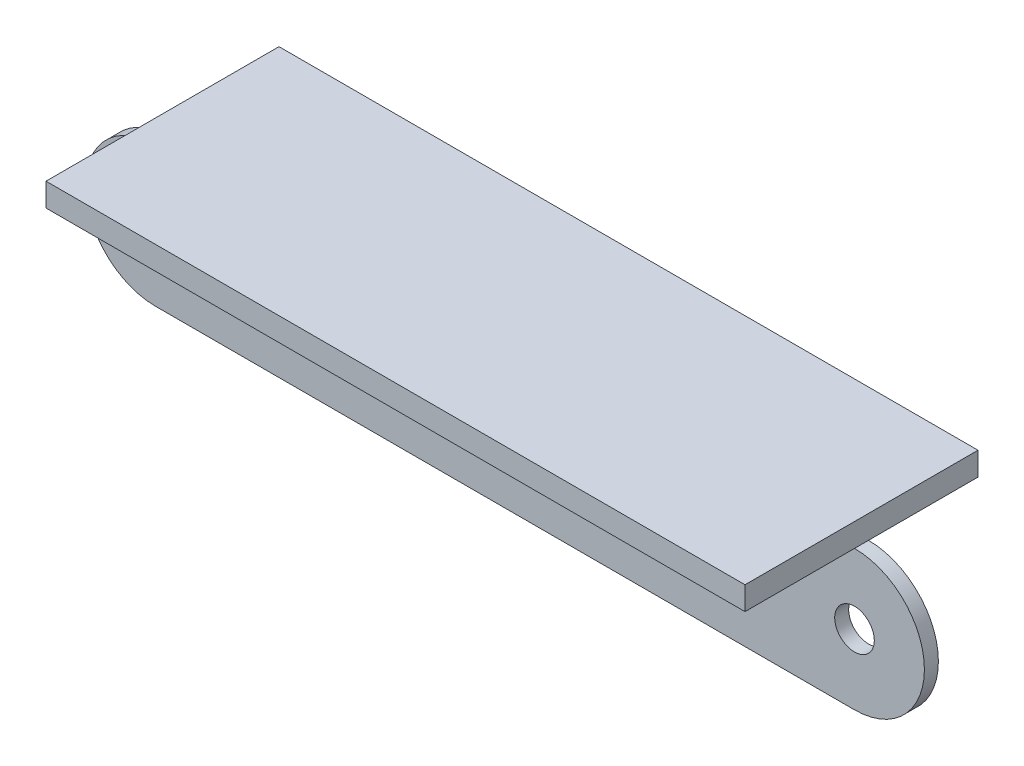
ISO-10303-21;
HEADER;
FILE_DESCRIPTION(('STEP AP214'),'2;1');
FILE_NAME('part.step','',(''),(''),'','','');
FILE_SCHEMA(('AUTOMOTIVE_DESIGN { 1 0 10303 214 1 1 1 1 }'));
ENDSEC;
DATA;
#1=APPLICATION_CONTEXT('core data for automotive mechanical design processes');
#2=APPLICATION_PROTOCOL_DEFINITION('international standard','automotive_design',2000,#1);
#3=PRODUCT_CONTEXT('',#1,'mechanical');
#4=PRODUCT('Part','Part','',(#3));
#5=PRODUCT_RELATED_PRODUCT_CATEGORY('part','',(#4));
#6=PRODUCT_DEFINITION_FORMATION('','',#4);
#7=PRODUCT_DEFINITION_CONTEXT('part definition',#1,'design');
#8=PRODUCT_DEFINITION('design','',#6,#7);
#9=PRODUCT_DEFINITION_SHAPE('','',#8);
#10=(LENGTH_UNIT() NAMED_UNIT(*) SI_UNIT(.MILLI.,.METRE.));
#11=(NAMED_UNIT(*) PLANE_ANGLE_UNIT() SI_UNIT($,.RADIAN.));
#12=(NAMED_UNIT(*) SI_UNIT($,.STERADIAN.) SOLID_ANGLE_UNIT());
#13=UNCERTAINTY_MEASURE_WITH_UNIT(LENGTH_MEASURE(1.E-05),#10,'distance_accuracy_value','');
#14=(GEOMETRIC_REPRESENTATION_CONTEXT(3) GLOBAL_UNCERTAINTY_ASSIGNED_CONTEXT((#13)) GLOBAL_UNIT_ASSIGNED_CONTEXT((#10,
#11,#12)) REPRESENTATION_CONTEXT('',''));
#15=CARTESIAN_POINT('',(0.,0.,0.));
#16=DIRECTION('',(0.,0.,1.));
#17=DIRECTION('',(1.,0.,0.));
#18=AXIS2_PLACEMENT_3D('',#15,#16,#17);
#19=CARTESIAN_POINT('',(-85.207100591716,11.1834319526627,3.));
#20=DIRECTION('',(0.,0.,-1.));
#21=DIRECTION('',(-1.,0.,0.));
#22=AXIS2_PLACEMENT_3D('',#19,#20,#21);
#23=PLANE('',#22);
#24=DIRECTION('',(-1.,0.,0.));
#25=VECTOR('',#24,1.);
#26=CARTESIAN_POINT('',(-85.207100591716,26.1834319526627,3.));
#27=LINE('',#26,#25);
#28=CARTESIAN_POINT('',(64.792899408284,26.1834319526627,3.));
#29=VERTEX_POINT('',#28);
#30=CARTESIAN_POINT('',(39.792899408284,26.1834319526627,3.));
#31=VERTEX_POINT('',#30);
#32=EDGE_CURVE('E277',#29,#31,#27,.T.);
#33=ORIENTED_EDGE('',*,*,#32,.T.);
#34=DIRECTION('',(0.,-1.,0.));
#35=VECTOR('',#34,1.);
#36=CARTESIAN_POINT('',(39.792899408284,26.1834319526627,3.));
#37=LINE('',#36,#35);
#38=CARTESIAN_POINT('',(39.792899408284,19.6834319526627,3.));
#39=VERTEX_POINT('',#38);
#40=EDGE_CURVE('E179',#31,#39,#37,.T.);
#41=ORIENTED_EDGE('',*,*,#40,.T.);
#42=DIRECTION('',(-1.,0.,0.));
#43=VECTOR('',#42,1.);
#44=CARTESIAN_POINT('',(39.792899408284,19.6834319526627,3.));
#45=LINE('',#44,#43);
#46=CARTESIAN_POINT('',(-60.207100591716,19.6834319526627,3.));
#47=VERTEX_POINT('',#46);
#48=EDGE_CURVE('E189',#39,#47,#45,.T.);
#49=ORIENTED_EDGE('',*,*,#48,.T.);
#50=DIRECTION('',(0.,-1.,0.));
#51=VECTOR('',#50,1.);
#52=CARTESIAN_POINT('',(-60.207100591716,26.1834319526627,3.));
#53=LINE('',#52,#51);
#54=CARTESIAN_POINT('',(-60.207100591716,26.1834319526627,3.));
#55=VERTEX_POINT('',#54);
#56=EDGE_CURVE('E164',#55,#47,#53,.T.);
#57=ORIENTED_EDGE('',*,*,#56,.F.);
#58=CARTESIAN_POINT('',(-85.207100591716,26.1834319526627,3.));
#59=VERTEX_POINT('',#58);
#60=EDGE_CURVE('E276',#55,#59,#27,.T.);
#61=ORIENTED_EDGE('',*,*,#60,.T.);
#62=CARTESIAN_POINT('',(-85.207100591716,11.1834319526627,3.));
#63=DIRECTION('',(0.,0.,1.));
#64=DIRECTION('',(-1.,0.,0.));
#65=AXIS2_PLACEMENT_3D('',#62,#63,#64);
#66=CIRCLE('',#65,15.);
#67=CARTESIAN_POINT('',(-85.207100591716,-3.81656804733729,3.));
#68=VERTEX_POINT('',#67);
#69=EDGE_CURVE('E265',#59,#68,#66,.T.);
#70=ORIENTED_EDGE('',*,*,#69,.T.);
#71=DIRECTION('',(1.,0.,0.));
#72=VECTOR('',#71,1.);
#73=CARTESIAN_POINT('',(-85.207100591716,-3.81656804733729,3.));
#74=LINE('',#73,#72);
#75=CARTESIAN_POINT('',(64.792899408284,-3.81656804733729,3.));
#76=VERTEX_POINT('',#75);
#77=EDGE_CURVE('E269',#68,#76,#74,.T.);
#78=ORIENTED_EDGE('',*,*,#77,.T.);
#79=CARTESIAN_POINT('',(64.792899408284,11.1834319526627,3.));
#80=DIRECTION('',(0.,0.,1.));
#81=DIRECTION('',(-1.,0.,0.));
#82=AXIS2_PLACEMENT_3D('',#79,#80,#81);
#83=CIRCLE('',#82,15.);
#84=EDGE_CURVE('E273',#76,#29,#83,.T.);
#85=ORIENTED_EDGE('',*,*,#84,.T.);
#86=EDGE_LOOP('',(#33,#41,#49,#57,#61,#70,#78,#85));
#87=FACE_BOUND('',#86,.T.);
#88=CARTESIAN_POINT('',(-85.207100591716,11.1834319526627,3.));
#89=DIRECTION('',(0.,0.,1.));
#90=DIRECTION('',(1.,0.,0.));
#91=AXIS2_PLACEMENT_3D('',#88,#89,#90);
#92=CIRCLE('',#91,4.25000000000001);
#93=CARTESIAN_POINT('',(-80.957100591716,11.1834319526627,3.));
#94=VERTEX_POINT('',#93);
#95=EDGE_CURVE('E257',#94,#94,#92,.T.);
#96=ORIENTED_EDGE('',*,*,#95,.F.);
#97=EDGE_LOOP('',(#96));
#98=FACE_BOUND('',#97,.T.);
#99=CARTESIAN_POINT('',(64.792899408284,11.1834319526627,3.));
#100=DIRECTION('',(0.,0.,1.));
#101=DIRECTION('',(1.,0.,0.));
#102=AXIS2_PLACEMENT_3D('',#99,#100,#101);
#103=CIRCLE('',#102,4.25000000000001);
#104=CARTESIAN_POINT('',(69.042899408284,11.1834319526627,3.));
#105=VERTEX_POINT('',#104);
#106=EDGE_CURVE('E249',#105,#105,#103,.T.);
#107=ORIENTED_EDGE('',*,*,#106,.F.);
#108=EDGE_LOOP('',(#107));
#109=FACE_BOUND('',#108,.T.);
#110=ADVANCED_FACE('F43',(#87,#98,#109),#23,.F.);
#111=CARTESIAN_POINT('',(-85.207100591716,11.1834319526627,0.));
#112=DIRECTION('',(0.,0.,-1.));
#113=DIRECTION('',(-1.,0.,0.));
#114=AXIS2_PLACEMENT_3D('',#111,#112,#113);
#115=PLANE('',#114);
#116=DIRECTION('',(0.,1.,0.));
#117=VECTOR('',#116,1.);
#118=CARTESIAN_POINT('',(39.792899408284,26.1834319526627,0.));
#119=LINE('',#118,#117);
#120=CARTESIAN_POINT('',(39.792899408284,19.6834319526627,0.));
#121=VERTEX_POINT('',#120);
#122=CARTESIAN_POINT('',(39.792899408284,26.1834319526627,0.));
#123=VERTEX_POINT('',#122);
#124=EDGE_CURVE('E154',#121,#123,#119,.T.);
#125=ORIENTED_EDGE('',*,*,#124,.T.);
#126=DIRECTION('',(-1.,0.,0.));
#127=VECTOR('',#126,1.);
#128=CARTESIAN_POINT('',(-85.207100591716,26.1834319526627,0.));
#129=LINE('',#128,#127);
#130=CARTESIAN_POINT('',(64.792899408284,26.1834319526627,0.));
#131=VERTEX_POINT('',#130);
#132=EDGE_CURVE('E270',#131,#123,#129,.T.);
#133=ORIENTED_EDGE('',*,*,#132,.F.);
#134=CARTESIAN_POINT('',(64.792899408284,11.1834319526627,0.));
#135=DIRECTION('',(0.,0.,1.));
#136=DIRECTION('',(-1.,0.,0.));
#137=AXIS2_PLACEMENT_3D('',#134,#135,#136);
#138=CIRCLE('',#137,15.);
#139=CARTESIAN_POINT('',(64.792899408284,-3.81656804733729,0.));
#140=VERTEX_POINT('',#139);
#141=EDGE_CURVE('E288',#140,#131,#138,.T.);
#142=ORIENTED_EDGE('',*,*,#141,.F.);
#143=DIRECTION('',(1.,0.,0.));
#144=VECTOR('',#143,1.);
#145=CARTESIAN_POINT('',(-85.207100591716,-3.81656804733729,0.));
#146=LINE('',#145,#144);
#147=CARTESIAN_POINT('',(-85.207100591716,-3.81656804733729,0.));
#148=VERTEX_POINT('',#147);
#149=EDGE_CURVE('E285',#148,#140,#146,.T.);
#150=ORIENTED_EDGE('',*,*,#149,.F.);
#151=CARTESIAN_POINT('',(-85.207100591716,11.1834319526627,0.));
#152=DIRECTION('',(0.,0.,1.));
#153=DIRECTION('',(-1.,0.,0.));
#154=AXIS2_PLACEMENT_3D('',#151,#152,#153);
#155=CIRCLE('',#154,15.);
#156=CARTESIAN_POINT('',(-85.207100591716,26.1834319526627,0.));
#157=VERTEX_POINT('',#156);
#158=EDGE_CURVE('E261',#157,#148,#155,.T.);
#159=ORIENTED_EDGE('',*,*,#158,.F.);
#160=CARTESIAN_POINT('',(-60.207100591716,26.1834319526627,0.));
#161=VERTEX_POINT('',#160);
#162=EDGE_CURVE('E292',#161,#157,#129,.T.);
#163=ORIENTED_EDGE('',*,*,#162,.F.);
#164=DIRECTION('',(0.,1.,0.));
#165=VECTOR('',#164,1.);
#166=CARTESIAN_POINT('',(-60.207100591716,26.1834319526627,0.));
#167=LINE('',#166,#165);
#168=CARTESIAN_POINT('',(-60.207100591716,19.6834319526627,0.));
#169=VERTEX_POINT('',#168);
#170=EDGE_CURVE('E64',#169,#161,#167,.T.);
#171=ORIENTED_EDGE('',*,*,#170,.F.);
#172=DIRECTION('',(-1.,0.,0.));
#173=VECTOR('',#172,1.);
#174=CARTESIAN_POINT('',(39.792899408284,19.6834319526627,0.));
#175=LINE('',#174,#173);
#176=EDGE_CURVE('E59',#121,#169,#175,.T.);
#177=ORIENTED_EDGE('',*,*,#176,.F.);
#178=EDGE_LOOP('',(#125,#133,#142,#150,#159,#163,#171,#177));
#179=FACE_BOUND('',#178,.T.);
#180=CARTESIAN_POINT('',(-85.207100591716,11.1834319526627,0.));
#181=DIRECTION('',(0.,0.,1.));
#182=DIRECTION('',(1.,0.,0.));
#183=AXIS2_PLACEMENT_3D('',#180,#181,#182);
#184=CIRCLE('',#183,4.25000000000001);
#185=CARTESIAN_POINT('',(-80.957100591716,11.1834319526627,0.));
#186=VERTEX_POINT('',#185);
#187=EDGE_CURVE('E253',#186,#186,#184,.T.);
#188=ORIENTED_EDGE('',*,*,#187,.T.);
#189=EDGE_LOOP('',(#188));
#190=FACE_BOUND('',#189,.T.);
#191=CARTESIAN_POINT('',(64.792899408284,11.1834319526627,0.));
#192=DIRECTION('',(0.,0.,1.));
#193=DIRECTION('',(1.,0.,0.));
#194=AXIS2_PLACEMENT_3D('',#191,#192,#193);
#195=CIRCLE('',#194,4.25000000000001);
#196=CARTESIAN_POINT('',(69.042899408284,11.1834319526627,0.));
#197=VERTEX_POINT('',#196);
#198=EDGE_CURVE('E248',#197,#197,#195,.T.);
#199=ORIENTED_EDGE('',*,*,#198,.T.);
#200=EDGE_LOOP('',(#199));
#201=FACE_BOUND('',#200,.T.);
#202=ADVANCED_FACE('F311',(#179,#190,#201),#115,.T.);
#203=CARTESIAN_POINT('',(-85.207100591716,11.1834319526627,3.));
#204=DIRECTION('',(0.,0.,-1.));
#205=DIRECTION('',(-1.,0.,0.));
#206=AXIS2_PLACEMENT_3D('',#203,#204,#205);
#207=CYLINDRICAL_SURFACE('',#206,15.);
#208=ORIENTED_EDGE('',*,*,#158,.T.);
#209=DIRECTION('',(0.,0.,-1.));
#210=VECTOR('',#209,1.);
#211=CARTESIAN_POINT('',(-85.207100591716,-3.81656804733729,3.));
#212=LINE('',#211,#210);
#213=EDGE_CURVE('E11',#68,#148,#212,.T.);
#214=ORIENTED_EDGE('',*,*,#213,.F.);
#215=ORIENTED_EDGE('',*,*,#69,.F.);
#216=DIRECTION('',(0.,0.,-1.));
#217=VECTOR('',#216,1.);
#218=CARTESIAN_POINT('',(-85.207100591716,26.1834319526627,3.));
#219=LINE('',#218,#217);
#220=EDGE_CURVE('E281',#59,#157,#219,.T.);
#221=ORIENTED_EDGE('',*,*,#220,.T.);
#222=EDGE_LOOP('',(#208,#214,#215,#221));
#223=FACE_BOUND('',#222,.T.);
#224=ADVANCED_FACE('F45',(#223),#207,.T.);
#225=CARTESIAN_POINT('',(-85.207100591716,-3.81656804733729,3.));
#226=DIRECTION('',(0.,1.,0.));
#227=DIRECTION('',(0.,0.,1.));
#228=AXIS2_PLACEMENT_3D('',#225,#226,#227);
#229=PLANE('',#228);
#230=ORIENTED_EDGE('',*,*,#149,.T.);
#231=DIRECTION('',(0.,0.,-1.));
#232=VECTOR('',#231,1.);
#233=CARTESIAN_POINT('',(64.792899408284,-3.81656804733729,3.));
#234=LINE('',#233,#232);
#235=EDGE_CURVE('E52',#76,#140,#234,.T.);
#236=ORIENTED_EDGE('',*,*,#235,.F.);
#237=ORIENTED_EDGE('',*,*,#77,.F.);
#238=ORIENTED_EDGE('',*,*,#213,.T.);
#239=EDGE_LOOP('',(#230,#236,#237,#238));
#240=FACE_BOUND('',#239,.T.);
#241=ADVANCED_FACE('F341',(#240),#229,.F.);
#242=CARTESIAN_POINT('',(64.792899408284,11.1834319526627,3.));
#243=DIRECTION('',(0.,0.,-1.));
#244=DIRECTION('',(-1.,0.,0.));
#245=AXIS2_PLACEMENT_3D('',#242,#243,#244);
#246=CYLINDRICAL_SURFACE('',#245,15.);
#247=ORIENTED_EDGE('',*,*,#141,.T.);
#248=DIRECTION('',(0.,0.,-1.));
#249=VECTOR('',#248,1.);
#250=CARTESIAN_POINT('',(64.792899408284,26.1834319526627,3.));
#251=LINE('',#250,#249);
#252=EDGE_CURVE('E298',#29,#131,#251,.T.);
#253=ORIENTED_EDGE('',*,*,#252,.F.);
#254=ORIENTED_EDGE('',*,*,#84,.F.);
#255=ORIENTED_EDGE('',*,*,#235,.T.);
#256=EDGE_LOOP('',(#247,#253,#254,#255));
#257=FACE_BOUND('',#256,.T.);
#258=ADVANCED_FACE('F307',(#257),#246,.T.);
#259=CARTESIAN_POINT('',(-85.207100591716,11.1834319526627,3.));
#260=DIRECTION('',(0.,0.,-1.));
#261=DIRECTION('',(-1.,0.,0.));
#262=AXIS2_PLACEMENT_3D('',#259,#260,#261);
#263=CYLINDRICAL_SURFACE('',#262,4.25000000000001);
#264=ORIENTED_EDGE('',*,*,#95,.T.);
#265=EDGE_LOOP('',(#264));
#266=FACE_BOUND('',#265,.T.);
#267=ORIENTED_EDGE('',*,*,#187,.F.);
#268=EDGE_LOOP('',(#267));
#269=FACE_BOUND('',#268,.T.);
#270=ADVANCED_FACE('F337',(#266,#269),#263,.F.);
#271=CARTESIAN_POINT('',(64.792899408284,11.1834319526627,3.));
#272=DIRECTION('',(0.,0.,-1.));
#273=DIRECTION('',(-1.,0.,0.));
#274=AXIS2_PLACEMENT_3D('',#271,#272,#273);
#275=CYLINDRICAL_SURFACE('',#274,4.25000000000001);
#276=ORIENTED_EDGE('',*,*,#106,.T.);
#277=EDGE_LOOP('',(#276));
#278=FACE_BOUND('',#277,.T.);
#279=ORIENTED_EDGE('',*,*,#198,.F.);
#280=EDGE_LOOP('',(#279));
#281=FACE_BOUND('',#280,.T.);
#282=ADVANCED_FACE('F408',(#278,#281),#275,.F.);
#283=CARTESIAN_POINT('',(0.,26.1834319526627,0.));
#284=DIRECTION('',(0.,1.,0.));
#285=DIRECTION('',(0.,0.,1.));
#286=AXIS2_PLACEMENT_3D('',#283,#284,#285);
#287=PLANE('',#286);
#288=DIRECTION('',(-1.,0.,0.));
#289=VECTOR('',#288,1.);
#290=CARTESIAN_POINT('',(39.792899408284,26.1834319526627,9.5));
#291=LINE('',#290,#289);
#292=CARTESIAN_POINT('',(39.792899408284,26.1834319526627,9.5));
#293=VERTEX_POINT('',#292);
#294=CARTESIAN_POINT('',(-60.207100591716,26.1834319526627,9.5));
#295=VERTEX_POINT('',#294);
#296=EDGE_CURVE('E197',#293,#295,#291,.T.);
#297=ORIENTED_EDGE('',*,*,#296,.F.);
#298=DIRECTION('',(0.,0.,-1.));
#299=VECTOR('',#298,1.);
#300=CARTESIAN_POINT('',(39.792899408284,26.1834319526627,9.5));
#301=LINE('',#300,#299);
#302=EDGE_CURVE('E187',#293,#31,#301,.T.);
#303=ORIENTED_EDGE('',*,*,#302,.T.);
#304=ORIENTED_EDGE('',*,*,#32,.F.);
#305=DIRECTION('',(0.,0.,-1.));
#306=VECTOR('',#305,1.);
#307=CARTESIAN_POINT('',(64.792899408284,26.1834319526627,-23.5));
#308=LINE('',#307,#306);
#309=CARTESIAN_POINT('',(64.792899408284,26.1834319526627,26.5));
#310=VERTEX_POINT('',#309);
#311=EDGE_CURVE('E227',#310,#29,#308,.T.);
#312=ORIENTED_EDGE('',*,*,#311,.F.);
#313=DIRECTION('',(1.,0.,0.));
#314=VECTOR('',#313,1.);
#315=CARTESIAN_POINT('',(-85.207100591716,26.1834319526627,26.5));
#316=LINE('',#315,#314);
#317=CARTESIAN_POINT('',(-85.207100591716,26.1834319526627,26.5));
#318=VERTEX_POINT('',#317);
#319=EDGE_CURVE('E223',#318,#310,#316,.T.);
#320=ORIENTED_EDGE('',*,*,#319,.F.);
#321=DIRECTION('',(0.,0.,1.));
#322=VECTOR('',#321,1.);
#323=CARTESIAN_POINT('',(-85.207100591716,26.1834319526627,-23.5));
#324=LINE('',#323,#322);
#325=EDGE_CURVE('E201',#59,#318,#324,.T.);
#326=ORIENTED_EDGE('',*,*,#325,.F.);
#327=ORIENTED_EDGE('',*,*,#60,.F.);
#328=DIRECTION('',(0.,0.,-1.));
#329=VECTOR('',#328,1.);
#330=CARTESIAN_POINT('',(-60.207100591716,26.1834319526627,9.5));
#331=LINE('',#330,#329);
#332=EDGE_CURVE('E183',#295,#55,#331,.T.);
#333=ORIENTED_EDGE('',*,*,#332,.F.);
#334=EDGE_LOOP('',(#297,#303,#304,#312,#320,#326,#327,#333));
#335=FACE_BOUND('',#334,.T.);
#336=ADVANCED_FACE('F363',(#335),#287,.F.);
#337=CARTESIAN_POINT('',(-85.207100591716,31.1834319526627,-23.5));
#338=DIRECTION('',(1.,0.,0.));
#339=DIRECTION('',(0.,0.,-1.));
#340=AXIS2_PLACEMENT_3D('',#337,#338,#339);
#341=PLANE('',#340);
#342=CARTESIAN_POINT('',(-85.207100591716,26.1834319526627,-23.5));
#343=VERTEX_POINT('',#342);
#344=EDGE_CURVE('E219',#343,#157,#324,.T.);
#345=ORIENTED_EDGE('',*,*,#344,.T.);
#346=ORIENTED_EDGE('',*,*,#220,.F.);
#347=ORIENTED_EDGE('',*,*,#325,.T.);
#348=DIRECTION('',(0.,-1.,0.));
#349=VECTOR('',#348,1.);
#350=CARTESIAN_POINT('',(-85.207100591716,31.1834319526627,26.5));
#351=LINE('',#350,#349);
#352=CARTESIAN_POINT('',(-85.207100591716,31.1834319526627,26.5));
#353=VERTEX_POINT('',#352);
#354=EDGE_CURVE('E244',#353,#318,#351,.T.);
#355=ORIENTED_EDGE('',*,*,#354,.F.);
#356=DIRECTION('',(0.,0.,1.));
#357=VECTOR('',#356,1.);
#358=CARTESIAN_POINT('',(-85.207100591716,31.1834319526627,-23.5));
#359=LINE('',#358,#357);
#360=CARTESIAN_POINT('',(-85.207100591716,31.1834319526627,-23.5));
#361=VERTEX_POINT('',#360);
#362=EDGE_CURVE('E204',#361,#353,#359,.T.);
#363=ORIENTED_EDGE('',*,*,#362,.F.);
#364=DIRECTION('',(0.,-1.,0.));
#365=VECTOR('',#364,1.);
#366=CARTESIAN_POINT('',(-85.207100591716,31.1834319526627,-23.5));
#367=LINE('',#366,#365);
#368=EDGE_CURVE('E218',#361,#343,#367,.T.);
#369=ORIENTED_EDGE('',*,*,#368,.T.);
#370=EDGE_LOOP('',(#345,#346,#347,#355,#363,#369));
#371=FACE_BOUND('',#370,.T.);
#372=ADVANCED_FACE('F352',(#371),#341,.F.);
#373=CARTESIAN_POINT('',(-85.207100591716,31.1834319526627,26.5));
#374=DIRECTION('',(0.,0.,-1.));
#375=DIRECTION('',(-1.,0.,0.));
#376=AXIS2_PLACEMENT_3D('',#373,#374,#375);
#377=PLANE('',#376);
#378=ORIENTED_EDGE('',*,*,#319,.T.);
#379=DIRECTION('',(0.,-1.,0.));
#380=VECTOR('',#379,1.);
#381=CARTESIAN_POINT('',(64.792899408284,31.1834319526627,26.5));
#382=LINE('',#381,#380);
#383=CARTESIAN_POINT('',(64.792899408284,31.1834319526627,26.5));
#384=VERTEX_POINT('',#383);
#385=EDGE_CURVE('E240',#384,#310,#382,.T.);
#386=ORIENTED_EDGE('',*,*,#385,.F.);
#387=DIRECTION('',(1.,0.,0.));
#388=VECTOR('',#387,1.);
#389=CARTESIAN_POINT('',(-85.207100591716,31.1834319526627,26.5));
#390=LINE('',#389,#388);
#391=EDGE_CURVE('E208',#353,#384,#390,.T.);
#392=ORIENTED_EDGE('',*,*,#391,.F.);
#393=ORIENTED_EDGE('',*,*,#354,.T.);
#394=EDGE_LOOP('',(#378,#386,#392,#393));
#395=FACE_BOUND('',#394,.T.);
#396=ADVANCED_FACE('F367',(#395),#377,.F.);
#397=CARTESIAN_POINT('',(64.792899408284,31.1834319526627,-23.5));
#398=DIRECTION('',(-1.,0.,0.));
#399=DIRECTION('',(0.,0.,1.));
#400=AXIS2_PLACEMENT_3D('',#397,#398,#399);
#401=PLANE('',#400);
#402=ORIENTED_EDGE('',*,*,#311,.T.);
#403=ORIENTED_EDGE('',*,*,#252,.T.);
#404=CARTESIAN_POINT('',(64.792899408284,26.1834319526627,-23.5));
#405=VERTEX_POINT('',#404);
#406=EDGE_CURVE('E226',#131,#405,#308,.T.);
#407=ORIENTED_EDGE('',*,*,#406,.T.);
#408=DIRECTION('',(0.,-1.,0.));
#409=VECTOR('',#408,1.);
#410=CARTESIAN_POINT('',(64.792899408284,31.1834319526627,-23.5));
#411=LINE('',#410,#409);
#412=CARTESIAN_POINT('',(64.792899408284,31.1834319526627,-23.5));
#413=VERTEX_POINT('',#412);
#414=EDGE_CURVE('E236',#413,#405,#411,.T.);
#415=ORIENTED_EDGE('',*,*,#414,.F.);
#416=DIRECTION('',(0.,0.,-1.));
#417=VECTOR('',#416,1.);
#418=CARTESIAN_POINT('',(64.792899408284,31.1834319526627,-23.5));
#419=LINE('',#418,#417);
#420=EDGE_CURVE('E212',#384,#413,#419,.T.);
#421=ORIENTED_EDGE('',*,*,#420,.F.);
#422=ORIENTED_EDGE('',*,*,#385,.T.);
#423=EDGE_LOOP('',(#402,#403,#407,#415,#421,#422));
#424=FACE_BOUND('',#423,.T.);
#425=ADVANCED_FACE('F376',(#424),#401,.F.);
#426=CARTESIAN_POINT('',(-85.207100591716,31.1834319526627,-23.5));
#427=DIRECTION('',(0.,0.,1.));
#428=DIRECTION('',(1.,0.,0.));
#429=AXIS2_PLACEMENT_3D('',#426,#427,#428);
#430=PLANE('',#429);
#431=DIRECTION('',(-1.,0.,0.));
#432=VECTOR('',#431,1.);
#433=CARTESIAN_POINT('',(-85.207100591716,26.1834319526627,-23.5));
#434=LINE('',#433,#432);
#435=EDGE_CURVE('E209',#405,#343,#434,.T.);
#436=ORIENTED_EDGE('',*,*,#435,.T.);
#437=ORIENTED_EDGE('',*,*,#368,.F.);
#438=DIRECTION('',(-1.,0.,0.));
#439=VECTOR('',#438,1.);
#440=CARTESIAN_POINT('',(-85.207100591716,31.1834319526627,-23.5));
#441=LINE('',#440,#439);
#442=EDGE_CURVE('E215',#413,#361,#441,.T.);
#443=ORIENTED_EDGE('',*,*,#442,.F.);
#444=ORIENTED_EDGE('',*,*,#414,.T.);
#445=EDGE_LOOP('',(#436,#437,#443,#444));
#446=FACE_BOUND('',#445,.T.);
#447=ADVANCED_FACE('F374',(#446),#430,.F.);
#448=CARTESIAN_POINT('',(0.,31.1834319526627,0.));
#449=DIRECTION('',(0.,1.,0.));
#450=DIRECTION('',(0.,0.,1.));
#451=AXIS2_PLACEMENT_3D('',#448,#449,#450);
#452=PLANE('',#451);
#453=ORIENTED_EDGE('',*,*,#362,.T.);
#454=ORIENTED_EDGE('',*,*,#391,.T.);
#455=ORIENTED_EDGE('',*,*,#420,.T.);
#456=ORIENTED_EDGE('',*,*,#442,.T.);
#457=EDGE_LOOP('',(#453,#454,#455,#456));
#458=FACE_BOUND('',#457,.T.);
#459=ADVANCED_FACE('F370',(#458),#452,.T.);
#460=ORIENTED_EDGE('',*,*,#132,.T.);
#461=DIRECTION('',(0.,0.,-1.));
#462=VECTOR('',#461,1.);
#463=CARTESIAN_POINT('',(39.792899408284,26.1834319526627,-6.50000000000031));
#464=LINE('',#463,#462);
#465=CARTESIAN_POINT('',(39.792899408284,26.1834319526627,-6.50000000000031));
#466=VERTEX_POINT('',#465);
#467=EDGE_CURVE('E150',#123,#466,#464,.T.);
#468=ORIENTED_EDGE('',*,*,#467,.T.);
#469=DIRECTION('',(-1.,0.,0.));
#470=VECTOR('',#469,1.);
#471=CARTESIAN_POINT('',(39.792899408284,26.1834319526627,-6.50000000000031));
#472=LINE('',#471,#470);
#473=CARTESIAN_POINT('',(-60.207100591716,26.1834319526627,-6.50000000000031));
#474=VERTEX_POINT('',#473);
#475=EDGE_CURVE('E143',#466,#474,#472,.T.);
#476=ORIENTED_EDGE('',*,*,#475,.T.);
#477=DIRECTION('',(0.,0.,-1.));
#478=VECTOR('',#477,1.);
#479=CARTESIAN_POINT('',(-60.207100591716,26.1834319526627,-6.50000000000031));
#480=LINE('',#479,#478);
#481=EDGE_CURVE('E148',#161,#474,#480,.T.);
#482=ORIENTED_EDGE('',*,*,#481,.F.);
#483=ORIENTED_EDGE('',*,*,#162,.T.);
#484=ORIENTED_EDGE('',*,*,#344,.F.);
#485=ORIENTED_EDGE('',*,*,#435,.F.);
#486=ORIENTED_EDGE('',*,*,#406,.F.);
#487=EDGE_LOOP('',(#460,#468,#476,#482,#483,#484,#485,#486));
#488=FACE_BOUND('',#487,.T.);
#489=ADVANCED_FACE('F146',(#488),#287,.F.);
#490=CARTESIAN_POINT('',(39.792899408284,19.6834319526627,3.));
#491=DIRECTION('',(0.,-0.707106781186548,0.707106781186547));
#492=DIRECTION('',(0.,-0.707106781186547,-0.707106781186548));
#493=AXIS2_PLACEMENT_3D('',#490,#491,#492);
#494=PLANE('',#493);
#495=DIRECTION('',(0.,0.707106781186547,0.707106781186548));
#496=VECTOR('',#495,1.);
#497=CARTESIAN_POINT('',(-60.207100591716,19.6834319526627,3.));
#498=LINE('',#497,#496);
#499=EDGE_CURVE('E168',#47,#295,#498,.T.);
#500=ORIENTED_EDGE('',*,*,#499,.F.);
#501=ORIENTED_EDGE('',*,*,#48,.F.);
#502=DIRECTION('',(0.,0.707106781186547,0.707106781186548));
#503=VECTOR('',#502,1.);
#504=CARTESIAN_POINT('',(39.792899408284,19.6834319526627,3.));
#505=LINE('',#504,#503);
#506=EDGE_CURVE('E182',#39,#293,#505,.T.);
#507=ORIENTED_EDGE('',*,*,#506,.T.);
#508=ORIENTED_EDGE('',*,*,#296,.T.);
#509=EDGE_LOOP('',(#500,#501,#507,#508));
#510=FACE_BOUND('',#509,.T.);
#511=ADVANCED_FACE('F385',(#510),#494,.T.);
#512=CARTESIAN_POINT('',(39.792899408284,0.,0.));
#513=DIRECTION('',(1.,0.,0.));
#514=DIRECTION('',(0.,0.,-1.));
#515=AXIS2_PLACEMENT_3D('',#512,#513,#514);
#516=PLANE('',#515);
#517=ORIENTED_EDGE('',*,*,#40,.F.);
#518=ORIENTED_EDGE('',*,*,#302,.F.);
#519=ORIENTED_EDGE('',*,*,#506,.F.);
#520=EDGE_LOOP('',(#517,#518,#519));
#521=FACE_BOUND('',#520,.T.);
#522=ADVANCED_FACE('F382',(#521),#516,.T.);
#523=CARTESIAN_POINT('',(-60.207100591716,0.,0.));
#524=DIRECTION('',(1.,0.,0.));
#525=DIRECTION('',(0.,0.,-1.));
#526=AXIS2_PLACEMENT_3D('',#523,#524,#525);
#527=PLANE('',#526);
#528=ORIENTED_EDGE('',*,*,#56,.T.);
#529=ORIENTED_EDGE('',*,*,#499,.T.);
#530=ORIENTED_EDGE('',*,*,#332,.T.);
#531=EDGE_LOOP('',(#528,#529,#530));
#532=FACE_BOUND('',#531,.T.);
#533=ADVANCED_FACE('F325',(#532),#527,.F.);
#534=CARTESIAN_POINT('',(39.792899408284,19.6834319526627,0.));
#535=DIRECTION('',(0.,-0.707106781186564,-0.707106781186531));
#536=DIRECTION('',(0.,0.707106781186531,-0.707106781186564));
#537=AXIS2_PLACEMENT_3D('',#534,#535,#536);
#538=PLANE('',#537);
#539=DIRECTION('',(0.,-0.707106781186531,0.707106781186564));
#540=VECTOR('',#539,1.);
#541=CARTESIAN_POINT('',(-60.207100591716,19.6834319526627,0.));
#542=LINE('',#541,#540);
#543=EDGE_CURVE('E157',#474,#169,#542,.T.);
#544=ORIENTED_EDGE('',*,*,#543,.F.);
#545=ORIENTED_EDGE('',*,*,#475,.F.);
#546=DIRECTION('',(0.,-0.707106781186531,0.707106781186564));
#547=VECTOR('',#546,1.);
#548=CARTESIAN_POINT('',(39.792899408284,19.6834319526627,0.));
#549=LINE('',#548,#547);
#550=EDGE_CURVE('E174',#466,#121,#549,.T.);
#551=ORIENTED_EDGE('',*,*,#550,.T.);
#552=ORIENTED_EDGE('',*,*,#176,.T.);
#553=EDGE_LOOP('',(#544,#545,#551,#552));
#554=FACE_BOUND('',#553,.T.);
#555=ADVANCED_FACE('F158',(#554),#538,.T.);
#556=CARTESIAN_POINT('',(39.792899408284,0.,0.));
#557=DIRECTION('',(1.,0.,0.));
#558=DIRECTION('',(0.,0.,-1.));
#559=AXIS2_PLACEMENT_3D('',#556,#557,#558);
#560=PLANE('',#559);
#561=ORIENTED_EDGE('',*,*,#467,.F.);
#562=ORIENTED_EDGE('',*,*,#124,.F.);
#563=ORIENTED_EDGE('',*,*,#550,.F.);
#564=EDGE_LOOP('',(#561,#562,#563));
#565=FACE_BOUND('',#564,.T.);
#566=ADVANCED_FACE('F317',(#565),#560,.T.);
#567=CARTESIAN_POINT('',(-60.207100591716,0.,0.));
#568=DIRECTION('',(1.,0.,0.));
#569=DIRECTION('',(0.,0.,-1.));
#570=AXIS2_PLACEMENT_3D('',#567,#568,#569);
#571=PLANE('',#570);
#572=ORIENTED_EDGE('',*,*,#481,.T.);
#573=ORIENTED_EDGE('',*,*,#543,.T.);
#574=ORIENTED_EDGE('',*,*,#170,.T.);
#575=EDGE_LOOP('',(#572,#573,#574));
#576=FACE_BOUND('',#575,.T.);
#577=ADVANCED_FACE('F162',(#576),#571,.F.);
#578=CLOSED_SHELL('',(#110,#202,#224,#241,#258,#270,#282,#336,#372,#396,#425,#447,#459,#489,
#511,#522,#533,#555,#566,#577));
#579=MANIFOLD_SOLID_BREP('B2',#578);
#580=ADVANCED_BREP_SHAPE_REPRESENTATION('',(#18,#579),#14);
#581=SHAPE_DEFINITION_REPRESENTATION(#9,#580);
ENDSEC;
END-ISO-10303-21;
